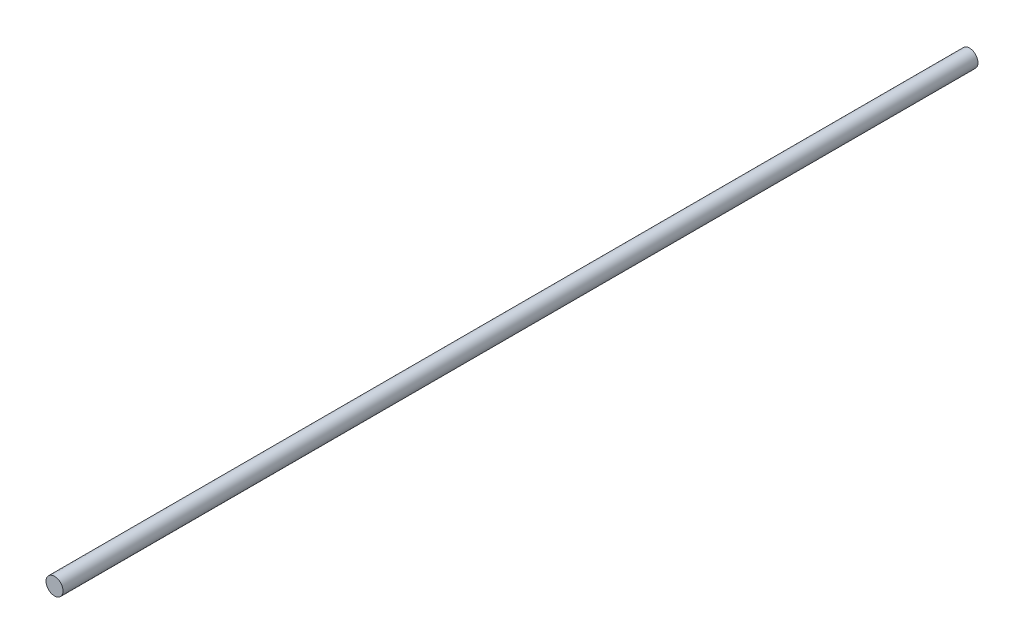
ISO-10303-21;
HEADER;
FILE_DESCRIPTION(('STEP AP214'),'2;1');
FILE_NAME('part.step','',(''),(''),'','','');
FILE_SCHEMA(('AUTOMOTIVE_DESIGN { 1 0 10303 214 1 1 1 1 }'));
ENDSEC;
DATA;
#1=APPLICATION_CONTEXT('core data for automotive mechanical design processes');
#2=APPLICATION_PROTOCOL_DEFINITION('international standard','automotive_design',2000,#1);
#3=PRODUCT_CONTEXT('',#1,'mechanical');
#4=PRODUCT('Part','Part','',(#3));
#5=PRODUCT_RELATED_PRODUCT_CATEGORY('part','',(#4));
#6=PRODUCT_DEFINITION_FORMATION('','',#4);
#7=PRODUCT_DEFINITION_CONTEXT('part definition',#1,'design');
#8=PRODUCT_DEFINITION('design','',#6,#7);
#9=PRODUCT_DEFINITION_SHAPE('','',#8);
#10=(LENGTH_UNIT() NAMED_UNIT(*) SI_UNIT(.MILLI.,.METRE.));
#11=(NAMED_UNIT(*) PLANE_ANGLE_UNIT() SI_UNIT($,.RADIAN.));
#12=(NAMED_UNIT(*) SI_UNIT($,.STERADIAN.) SOLID_ANGLE_UNIT());
#13=UNCERTAINTY_MEASURE_WITH_UNIT(LENGTH_MEASURE(1.E-05),#10,'distance_accuracy_value','');
#14=(GEOMETRIC_REPRESENTATION_CONTEXT(3) GLOBAL_UNCERTAINTY_ASSIGNED_CONTEXT((#13)) GLOBAL_UNIT_ASSIGNED_CONTEXT((#10,
#11,#12)) REPRESENTATION_CONTEXT('',''));
#15=CARTESIAN_POINT('',(0.,0.,0.));
#16=DIRECTION('',(0.,0.,1.));
#17=DIRECTION('',(1.,0.,0.));
#18=AXIS2_PLACEMENT_3D('',#15,#16,#17);
#19=CARTESIAN_POINT('',(0.,0.,430.));
#20=DIRECTION('',(0.,0.,-0.999999999999999));
#21=DIRECTION('',(-1.,0.,0.));
#22=AXIS2_PLACEMENT_3D('',#19,#20,#21);
#23=CYLINDRICAL_SURFACE('',#22,4.);
#24=CARTESIAN_POINT('',(0.,0.,430.));
#25=DIRECTION('',(0.,0.,0.999999999999999));
#26=DIRECTION('',(1.,0.,0.));
#27=AXIS2_PLACEMENT_3D('',#24,#25,#26);
#28=CIRCLE('',#27,4.);
#29=CARTESIAN_POINT('',(-4.,0.,430.));
#30=VERTEX_POINT('',#29);
#31=EDGE_CURVE('E10',#30,#30,#28,.T.);
#32=CARTESIAN_POINT('',(0.,0.,0.));
#33=DIRECTION('',(0.,0.,0.999999999999999));
#34=DIRECTION('',(1.,0.,0.));
#35=AXIS2_PLACEMENT_3D('',#32,#33,#34);
#36=CIRCLE('',#35,4.);
#37=CARTESIAN_POINT('',(-4.,0.,0.));
#38=VERTEX_POINT('',#37);
#39=EDGE_CURVE('E35',#38,#38,#36,.T.);
#40=CARTESIAN_POINT('',(-4.,0.,430.));
#41=CARTESIAN_POINT('',(-4.,0.,425.520833333333));
#42=CARTESIAN_POINT('',(-4.,0.,421.041666666666));
#43=CARTESIAN_POINT('',(-4.,0.,412.083333333333));
#44=CARTESIAN_POINT('',(-4.,0.,407.604166666666));
#45=CARTESIAN_POINT('',(-4.,0.,398.645833333333));
#46=CARTESIAN_POINT('',(-4.,0.,394.166666666666));
#47=CARTESIAN_POINT('',(-4.,0.,385.208333333333));
#48=CARTESIAN_POINT('',(-4.,0.,380.729166666666));
#49=CARTESIAN_POINT('',(-4.,0.,371.770833333333));
#50=CARTESIAN_POINT('',(-4.,0.,367.291666666666));
#51=CARTESIAN_POINT('',(-4.,0.,358.333333333333));
#52=CARTESIAN_POINT('',(-4.,0.,353.854166666666));
#53=CARTESIAN_POINT('',(-4.,0.,344.895833333333));
#54=CARTESIAN_POINT('',(-4.,0.,340.416666666666));
#55=CARTESIAN_POINT('',(-4.,0.,331.458333333333));
#56=CARTESIAN_POINT('',(-4.,0.,326.979166666666));
#57=CARTESIAN_POINT('',(-4.,0.,318.020833333333));
#58=CARTESIAN_POINT('',(-4.,0.,313.541666666666));
#59=CARTESIAN_POINT('',(-4.,0.,304.583333333333));
#60=CARTESIAN_POINT('',(-4.,0.,300.104166666666));
#61=CARTESIAN_POINT('',(-4.,0.,291.145833333333));
#62=CARTESIAN_POINT('',(-4.,0.,286.666666666666));
#63=CARTESIAN_POINT('',(-4.,0.,277.708333333333));
#64=CARTESIAN_POINT('',(-4.,0.,273.229166666666));
#65=CARTESIAN_POINT('',(-4.,0.,264.270833333333));
#66=CARTESIAN_POINT('',(-4.,0.,259.791666666666));
#67=CARTESIAN_POINT('',(-4.,0.,250.833333333333));
#68=CARTESIAN_POINT('',(-4.,0.,246.354166666666));
#69=CARTESIAN_POINT('',(-4.,0.,237.395833333333));
#70=CARTESIAN_POINT('',(-4.,0.,232.916666666666));
#71=CARTESIAN_POINT('',(-4.,0.,223.958333333333));
#72=CARTESIAN_POINT('',(-4.,0.,219.479166666666));
#73=CARTESIAN_POINT('',(-4.,0.,210.520833333333));
#74=CARTESIAN_POINT('',(-4.,0.,206.041666666666));
#75=CARTESIAN_POINT('',(-4.,0.,197.083333333333));
#76=CARTESIAN_POINT('',(-4.,0.,192.604166666666));
#77=CARTESIAN_POINT('',(-4.,0.,183.645833333333));
#78=CARTESIAN_POINT('',(-4.,0.,179.166666666666));
#79=CARTESIAN_POINT('',(-4.,0.,170.208333333333));
#80=CARTESIAN_POINT('',(-4.,0.,165.729166666667));
#81=CARTESIAN_POINT('',(-4.,0.,156.770833333333));
#82=CARTESIAN_POINT('',(-4.,0.,152.291666666667));
#83=CARTESIAN_POINT('',(-4.,0.,143.333333333333));
#84=CARTESIAN_POINT('',(-4.,0.,138.854166666667));
#85=CARTESIAN_POINT('',(-4.,0.,129.895833333333));
#86=CARTESIAN_POINT('',(-4.,0.,125.416666666667));
#87=CARTESIAN_POINT('',(-4.,0.,116.458333333333));
#88=CARTESIAN_POINT('',(-4.,0.,111.979166666667));
#89=CARTESIAN_POINT('',(-4.,0.,103.020833333333));
#90=CARTESIAN_POINT('',(-4.,0.,98.5416666666665));
#91=CARTESIAN_POINT('',(-4.,0.,89.5833333333332));
#92=CARTESIAN_POINT('',(-4.,0.,85.1041666666666));
#93=CARTESIAN_POINT('',(-4.,0.,76.1458333333333));
#94=CARTESIAN_POINT('',(-4.,0.,71.6666666666666));
#95=CARTESIAN_POINT('',(-4.,0.,62.7083333333333));
#96=CARTESIAN_POINT('',(-4.,0.,58.2291666666666));
#97=CARTESIAN_POINT('',(-4.,0.,49.2708333333333));
#98=CARTESIAN_POINT('',(-4.,0.,44.7916666666666));
#99=CARTESIAN_POINT('',(-4.,0.,35.8333333333333));
#100=CARTESIAN_POINT('',(-4.,0.,31.3541666666666));
#101=CARTESIAN_POINT('',(-4.,0.,22.3958333333333));
#102=CARTESIAN_POINT('',(-4.,0.,17.9166666666666));
#103=CARTESIAN_POINT('',(-4.,0.,8.95833333333333));
#104=CARTESIAN_POINT('',(-4.,0.,4.47916666666667));
#105=CARTESIAN_POINT('',(-4.,0.,0.));
#106=B_SPLINE_CURVE_WITH_KNOTS('',3,(#40,#41,#42,#43,#44,#45,#46,#47,#48,#49,#50,#51,#52,#53,
#54,#55,#56,#57,#58,#59,#60,#61,#62,#63,#64,#65,#66,#67,#68,#69,#70,#71,#72,#73,#74,#75,#76,#77,
#78,#79,#80,#81,#82,#83,#84,#85,#86,#87,#88,#89,#90,#91,#92,#93,#94,#95,#96,#97,#98,#99,#100,
#101,#102,#103,#104,#105),.UNSPECIFIED.,.F.,.F.,(4,2,2,2,2,2,2,2,2,2,2,2,2,2,2,2,2,2,2,2,2,2,2,
2,2,2,2,2,2,2,2,2,4),(0.,13.4375,26.875,40.3125,53.75,67.1875,80.6249999999999,94.0624999999999,
107.5,120.9375,134.375,147.8125,161.25,174.6875,188.125,201.5625,215.,228.4375,241.875,255.3125,
268.75,282.1875,295.625,309.0625,322.5,335.9375,349.375,362.8125,376.25,389.6875,403.125,
416.5625,430.),.UNSPECIFIED.);
#107=EDGE_CURVE('BSEAM32',#30,#38,#106,.T.);
#108=ORIENTED_EDGE('',*,*,#31,.F.);
#109=ORIENTED_EDGE('',*,*,#39,.T.);
#110=ORIENTED_EDGE('',*,*,#107,.T.);
#111=ORIENTED_EDGE('',*,*,#107,.F.);
#112=EDGE_LOOP('',(#108,#110,#109,#111));
#113=FACE_BOUND('',#112,.T.);
#114=ADVANCED_FACE('F32',(#113),#23,.T.);
#115=CARTESIAN_POINT('',(0.,0.,430.));
#116=DIRECTION('',(0.,0.,0.999999999999999));
#117=DIRECTION('',(1.,0.,0.));
#118=AXIS2_PLACEMENT_3D('',#115,#116,#117);
#119=PLANE('',#118);
#120=ORIENTED_EDGE('',*,*,#31,.T.);
#121=EDGE_LOOP('',(#120));
#122=FACE_BOUND('',#121,.T.);
#123=ADVANCED_FACE('F51',(#122),#119,.T.);
#124=CARTESIAN_POINT('',(0.,0.,0.));
#125=DIRECTION('',(0.,0.,0.999999999999999));
#126=DIRECTION('',(1.,0.,0.));
#127=AXIS2_PLACEMENT_3D('',#124,#125,#126);
#128=PLANE('',#127);
#129=ORIENTED_EDGE('',*,*,#39,.F.);
#130=EDGE_LOOP('',(#129));
#131=FACE_BOUND('',#130,.T.);
#132=ADVANCED_FACE('F49',(#131),#128,.F.);
#133=CLOSED_SHELL('',(#114,#123,#132));
#134=MANIFOLD_SOLID_BREP('B2',#133);
#135=ADVANCED_BREP_SHAPE_REPRESENTATION('',(#18,#134),#14);
#136=SHAPE_DEFINITION_REPRESENTATION(#9,#135);
ENDSEC;
END-ISO-10303-21;
